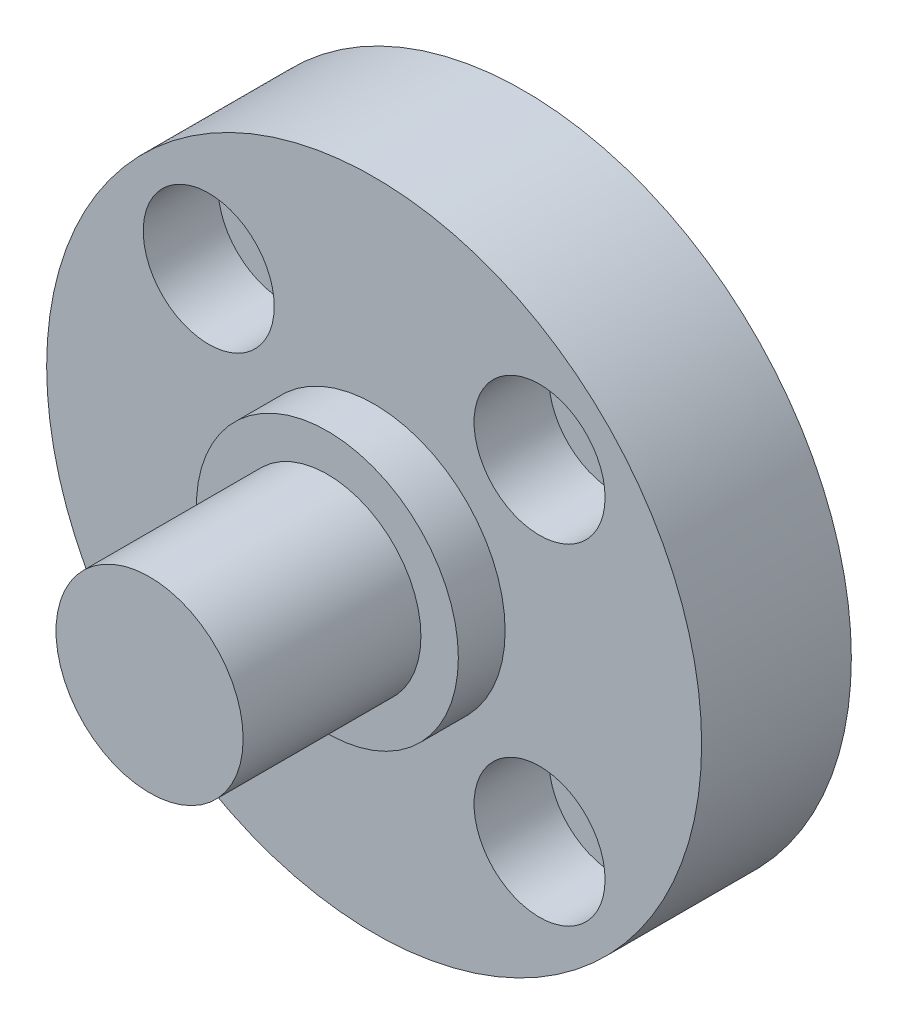
ISO-10303-21;
HEADER;
FILE_DESCRIPTION(('STEP AP214'),'2;1');
FILE_NAME('part.step','',(''),(''),'','','');
FILE_SCHEMA(('AUTOMOTIVE_DESIGN { 1 0 10303 214 1 1 1 1 }'));
ENDSEC;
DATA;
#1=APPLICATION_CONTEXT('core data for automotive mechanical design processes');
#2=APPLICATION_PROTOCOL_DEFINITION('international standard','automotive_design',2000,#1);
#3=PRODUCT_CONTEXT('',#1,'mechanical');
#4=PRODUCT('Part','Part','',(#3));
#5=PRODUCT_RELATED_PRODUCT_CATEGORY('part','',(#4));
#6=PRODUCT_DEFINITION_FORMATION('','',#4);
#7=PRODUCT_DEFINITION_CONTEXT('part definition',#1,'design');
#8=PRODUCT_DEFINITION('design','',#6,#7);
#9=PRODUCT_DEFINITION_SHAPE('','',#8);
#10=(LENGTH_UNIT() NAMED_UNIT(*) SI_UNIT(.MILLI.,.METRE.));
#11=(NAMED_UNIT(*) PLANE_ANGLE_UNIT() SI_UNIT($,.RADIAN.));
#12=(NAMED_UNIT(*) SI_UNIT($,.STERADIAN.) SOLID_ANGLE_UNIT());
#13=UNCERTAINTY_MEASURE_WITH_UNIT(LENGTH_MEASURE(1.E-05),#10,'distance_accuracy_value','');
#14=(GEOMETRIC_REPRESENTATION_CONTEXT(3) GLOBAL_UNCERTAINTY_ASSIGNED_CONTEXT((#13)) GLOBAL_UNIT_ASSIGNED_CONTEXT((#10,
#11,#12)) REPRESENTATION_CONTEXT('',''));
#15=CARTESIAN_POINT('',(0.,0.,0.));
#16=DIRECTION('',(0.,0.,1.));
#17=DIRECTION('',(1.,0.,0.));
#18=AXIS2_PLACEMENT_3D('',#15,#16,#17);
#19=CARTESIAN_POINT('',(8.83883476483184,8.83883476483185,0.));
#20=DIRECTION('',(0.,0.,1.));
#21=DIRECTION('',(1.,0.,0.));
#22=AXIS2_PLACEMENT_3D('',#19,#20,#21);
#23=CYLINDRICAL_SURFACE('',#22,1.6);
#24=CARTESIAN_POINT('',(8.83883476483184,8.83883476483185,0.));
#25=DIRECTION('',(0.,0.,1.));
#26=DIRECTION('',(1.,0.,0.));
#27=AXIS2_PLACEMENT_3D('',#24,#25,#26);
#28=CIRCLE('',#27,1.6);
#29=CARTESIAN_POINT('',(10.4388347648318,8.83883476483185,0.));
#30=VERTEX_POINT('',#29);
#31=EDGE_CURVE('E286',#30,#30,#28,.T.);
#32=ORIENTED_EDGE('',*,*,#31,.F.);
#33=EDGE_LOOP('',(#32));
#34=FACE_BOUND('',#33,.T.);
#35=CARTESIAN_POINT('',(8.83883476483184,8.83883476483185,4.));
#36=DIRECTION('',(0.,0.,1.));
#37=DIRECTION('',(1.,0.,0.));
#38=AXIS2_PLACEMENT_3D('',#35,#36,#37);
#39=CIRCLE('',#38,1.6);
#40=CARTESIAN_POINT('',(10.4388347648318,8.83883476483185,4.));
#41=VERTEX_POINT('',#40);
#42=EDGE_CURVE('E273',#41,#41,#39,.T.);
#43=ORIENTED_EDGE('',*,*,#42,.T.);
#44=EDGE_LOOP('',(#43));
#45=FACE_BOUND('',#44,.T.);
#46=ADVANCED_FACE('F32',(#34,#45),#23,.F.);
#47=CARTESIAN_POINT('',(8.83883476483184,-8.83883476483184,0.));
#48=DIRECTION('',(0.,0.,1.));
#49=DIRECTION('',(1.,0.,0.));
#50=AXIS2_PLACEMENT_3D('',#47,#48,#49);
#51=CYLINDRICAL_SURFACE('',#50,1.60000000000002);
#52=CARTESIAN_POINT('',(8.83883476483184,-8.83883476483184,0.));
#53=DIRECTION('',(0.,0.,1.));
#54=DIRECTION('',(1.,0.,0.));
#55=AXIS2_PLACEMENT_3D('',#52,#53,#54);
#56=CIRCLE('',#55,1.60000000000002);
#57=CARTESIAN_POINT('',(10.4388347648319,-8.83883476483184,0.));
#58=VERTEX_POINT('',#57);
#59=EDGE_CURVE('E283',#58,#58,#56,.T.);
#60=ORIENTED_EDGE('',*,*,#59,.F.);
#61=EDGE_LOOP('',(#60));
#62=FACE_BOUND('',#61,.T.);
#63=CARTESIAN_POINT('',(8.83883476483184,-8.83883476483184,4.));
#64=DIRECTION('',(0.,0.,1.));
#65=DIRECTION('',(1.,0.,0.));
#66=AXIS2_PLACEMENT_3D('',#63,#64,#65);
#67=CIRCLE('',#66,1.60000000000002);
#68=CARTESIAN_POINT('',(10.4388347648319,-8.83883476483184,4.));
#69=VERTEX_POINT('',#68);
#70=EDGE_CURVE('E306',#69,#69,#67,.T.);
#71=ORIENTED_EDGE('',*,*,#70,.T.);
#72=EDGE_LOOP('',(#71));
#73=FACE_BOUND('',#72,.T.);
#74=ADVANCED_FACE('F77',(#62,#73),#51,.F.);
#75=CARTESIAN_POINT('',(-8.83883476483185,-8.83883476483184,0.));
#76=DIRECTION('',(0.,0.,1.));
#77=DIRECTION('',(1.,0.,0.));
#78=AXIS2_PLACEMENT_3D('',#75,#76,#77);
#79=CYLINDRICAL_SURFACE('',#78,1.60000000000004);
#80=CARTESIAN_POINT('',(-8.83883476483185,-8.83883476483184,0.));
#81=DIRECTION('',(0.,0.,1.));
#82=DIRECTION('',(1.,0.,0.));
#83=AXIS2_PLACEMENT_3D('',#80,#81,#82);
#84=CIRCLE('',#83,1.60000000000004);
#85=CARTESIAN_POINT('',(-7.23883476483181,-8.83883476483184,0.));
#86=VERTEX_POINT('',#85);
#87=EDGE_CURVE('E287',#86,#86,#84,.T.);
#88=ORIENTED_EDGE('',*,*,#87,.F.);
#89=EDGE_LOOP('',(#88));
#90=FACE_BOUND('',#89,.T.);
#91=CARTESIAN_POINT('',(-8.83883476483185,-8.83883476483184,4.));
#92=DIRECTION('',(0.,0.,1.));
#93=DIRECTION('',(1.,0.,0.));
#94=AXIS2_PLACEMENT_3D('',#91,#92,#93);
#95=CIRCLE('',#94,1.60000000000004);
#96=CARTESIAN_POINT('',(-7.23883476483181,-8.83883476483184,4.));
#97=VERTEX_POINT('',#96);
#98=EDGE_CURVE('E271',#97,#97,#95,.T.);
#99=ORIENTED_EDGE('',*,*,#98,.T.);
#100=EDGE_LOOP('',(#99));
#101=FACE_BOUND('',#100,.T.);
#102=ADVANCED_FACE('F83',(#90,#101),#79,.F.);
#103=CARTESIAN_POINT('',(-8.83883476483185,8.83883476483184,0.));
#104=DIRECTION('',(0.,0.,1.));
#105=DIRECTION('',(1.,0.,0.));
#106=AXIS2_PLACEMENT_3D('',#103,#104,#105);
#107=CYLINDRICAL_SURFACE('',#106,1.60000000000006);
#108=CARTESIAN_POINT('',(-8.83883476483185,8.83883476483184,0.));
#109=DIRECTION('',(0.,0.,1.));
#110=DIRECTION('',(1.,0.,0.));
#111=AXIS2_PLACEMENT_3D('',#108,#109,#110);
#112=CIRCLE('',#111,1.60000000000006);
#113=CARTESIAN_POINT('',(-7.23883476483179,8.83883476483184,0.));
#114=VERTEX_POINT('',#113);
#115=EDGE_CURVE('E257',#114,#114,#112,.T.);
#116=ORIENTED_EDGE('',*,*,#115,.F.);
#117=EDGE_LOOP('',(#116));
#118=FACE_BOUND('',#117,.T.);
#119=CARTESIAN_POINT('',(-8.83883476483185,8.83883476483184,4.));
#120=DIRECTION('',(0.,0.,1.));
#121=DIRECTION('',(1.,0.,0.));
#122=AXIS2_PLACEMENT_3D('',#119,#120,#121);
#123=CIRCLE('',#122,1.60000000000006);
#124=CARTESIAN_POINT('',(-7.23883476483179,8.83883476483184,4.));
#125=VERTEX_POINT('',#124);
#126=EDGE_CURVE('E260',#125,#125,#123,.T.);
#127=ORIENTED_EDGE('',*,*,#126,.T.);
#128=EDGE_LOOP('',(#127));
#129=FACE_BOUND('',#128,.T.);
#130=ADVANCED_FACE('F90',(#118,#129),#107,.F.);
#131=CARTESIAN_POINT('',(0.,0.,8.));
#132=DIRECTION('',(0.,0.,-1.));
#133=DIRECTION('',(-1.,0.,0.));
#134=AXIS2_PLACEMENT_3D('',#131,#132,#133);
#135=CYLINDRICAL_SURFACE('',#134,17.5);
#136=CARTESIAN_POINT('',(0.,0.,8.));
#137=DIRECTION('',(0.,0.,1.));
#138=DIRECTION('',(1.,0.,0.));
#139=AXIS2_PLACEMENT_3D('',#136,#137,#138);
#140=CIRCLE('',#139,17.5);
#141=CARTESIAN_POINT('',(17.5,0.,8.));
#142=VERTEX_POINT('',#141);
#143=EDGE_CURVE('E45',#142,#142,#140,.T.);
#144=ORIENTED_EDGE('',*,*,#143,.F.);
#145=EDGE_LOOP('',(#144));
#146=FACE_BOUND('',#145,.T.);
#147=CARTESIAN_POINT('',(0.,0.,0.));
#148=DIRECTION('',(0.,0.,1.));
#149=DIRECTION('',(1.,0.,0.));
#150=AXIS2_PLACEMENT_3D('',#147,#148,#149);
#151=CIRCLE('',#150,17.5);
#152=CARTESIAN_POINT('',(17.5,0.,0.));
#153=VERTEX_POINT('',#152);
#154=EDGE_CURVE('E36',#153,#153,#151,.T.);
#155=ORIENTED_EDGE('',*,*,#154,.T.);
#156=EDGE_LOOP('',(#155));
#157=FACE_BOUND('',#156,.T.);
#158=ADVANCED_FACE('F34',(#146,#157),#135,.T.);
#159=CARTESIAN_POINT('',(0.,0.,8.));
#160=DIRECTION('',(0.,0.,1.));
#161=DIRECTION('',(1.,0.,0.));
#162=AXIS2_PLACEMENT_3D('',#159,#160,#161);
#163=PLANE('',#162);
#164=CARTESIAN_POINT('',(-8.83883476483185,8.83883476483184,8.));
#165=DIRECTION('',(0.,0.,1.));
#166=DIRECTION('',(1.,0.,0.));
#167=AXIS2_PLACEMENT_3D('',#164,#165,#166);
#168=CIRCLE('',#167,3.50000000000006);
#169=CARTESIAN_POINT('',(-5.33883476483179,8.83883476483184,8.));
#170=VERTEX_POINT('',#169);
#171=EDGE_CURVE('E261',#170,#170,#168,.T.);
#172=ORIENTED_EDGE('',*,*,#171,.F.);
#173=EDGE_LOOP('',(#172));
#174=FACE_BOUND('',#173,.T.);
#175=CARTESIAN_POINT('',(-8.83883476483184,-8.83883476483185,8.));
#176=DIRECTION('',(0.,0.,1.));
#177=DIRECTION('',(1.,0.,0.));
#178=AXIS2_PLACEMENT_3D('',#175,#176,#177);
#179=CIRCLE('',#178,3.50000000000004);
#180=CARTESIAN_POINT('',(-5.3388347648318,-8.83883476483185,8.));
#181=VERTEX_POINT('',#180);
#182=EDGE_CURVE('E268',#181,#181,#179,.T.);
#183=ORIENTED_EDGE('',*,*,#182,.F.);
#184=EDGE_LOOP('',(#183));
#185=FACE_BOUND('',#184,.T.);
#186=CARTESIAN_POINT('',(8.83883476483184,-8.83883476483184,8.));
#187=DIRECTION('',(0.,0.,1.));
#188=DIRECTION('',(1.,0.,0.));
#189=AXIS2_PLACEMENT_3D('',#186,#187,#188);
#190=CIRCLE('',#189,3.50000000000002);
#191=CARTESIAN_POINT('',(12.3388347648319,-8.83883476483184,8.));
#192=VERTEX_POINT('',#191);
#193=EDGE_CURVE('E303',#192,#192,#190,.T.);
#194=ORIENTED_EDGE('',*,*,#193,.F.);
#195=EDGE_LOOP('',(#194));
#196=FACE_BOUND('',#195,.T.);
#197=CARTESIAN_POINT('',(8.83883476483184,8.83883476483185,8.));
#198=DIRECTION('',(0.,0.,1.));
#199=DIRECTION('',(1.,0.,0.));
#200=AXIS2_PLACEMENT_3D('',#197,#198,#199);
#201=CIRCLE('',#200,3.5);
#202=CARTESIAN_POINT('',(12.3388347648318,8.83883476483185,8.));
#203=VERTEX_POINT('',#202);
#204=EDGE_CURVE('E276',#203,#203,#201,.T.);
#205=ORIENTED_EDGE('',*,*,#204,.F.);
#206=EDGE_LOOP('',(#205));
#207=FACE_BOUND('',#206,.T.);
#208=CARTESIAN_POINT('',(0.,0.,8.));
#209=DIRECTION('',(0.,0.,1.));
#210=DIRECTION('',(1.,0.,0.));
#211=AXIS2_PLACEMENT_3D('',#208,#209,#210);
#212=CIRCLE('',#211,7.);
#213=CARTESIAN_POINT('',(7.,0.,8.));
#214=VERTEX_POINT('',#213);
#215=EDGE_CURVE('E40',#214,#214,#212,.T.);
#216=ORIENTED_EDGE('',*,*,#215,.F.);
#217=EDGE_LOOP('',(#216));
#218=FACE_BOUND('',#217,.T.);
#219=ORIENTED_EDGE('',*,*,#143,.T.);
#220=EDGE_LOOP('',(#219));
#221=FACE_BOUND('',#220,.T.);
#222=ADVANCED_FACE('F63',(#174,#185,#196,#207,#218,#221),#163,.T.);
#223=CARTESIAN_POINT('',(0.,0.,0.));
#224=DIRECTION('',(0.,0.,1.));
#225=DIRECTION('',(1.,0.,0.));
#226=AXIS2_PLACEMENT_3D('',#223,#224,#225);
#227=PLANE('',#226);
#228=ORIENTED_EDGE('',*,*,#115,.T.);
#229=EDGE_LOOP('',(#228));
#230=FACE_BOUND('',#229,.T.);
#231=ORIENTED_EDGE('',*,*,#87,.T.);
#232=EDGE_LOOP('',(#231));
#233=FACE_BOUND('',#232,.T.);
#234=ORIENTED_EDGE('',*,*,#59,.T.);
#235=EDGE_LOOP('',(#234));
#236=FACE_BOUND('',#235,.T.);
#237=ORIENTED_EDGE('',*,*,#31,.T.);
#238=EDGE_LOOP('',(#237));
#239=FACE_BOUND('',#238,.T.);
#240=ORIENTED_EDGE('',*,*,#154,.F.);
#241=EDGE_LOOP('',(#240));
#242=FACE_BOUND('',#241,.T.);
#243=ADVANCED_FACE('F60',(#230,#233,#236,#239,#242),#227,.F.);
#244=CARTESIAN_POINT('',(0.,0.,10.5));
#245=DIRECTION('',(0.,0.,-1.));
#246=DIRECTION('',(-1.,0.,0.));
#247=AXIS2_PLACEMENT_3D('',#244,#245,#246);
#248=CYLINDRICAL_SURFACE('',#247,7.);
#249=CARTESIAN_POINT('',(0.,0.,10.5));
#250=DIRECTION('',(0.,0.,1.));
#251=DIRECTION('',(1.,0.,0.));
#252=AXIS2_PLACEMENT_3D('',#249,#250,#251);
#253=CIRCLE('',#252,7.);
#254=CARTESIAN_POINT('',(7.,0.,10.5));
#255=VERTEX_POINT('',#254);
#256=EDGE_CURVE('E51',#255,#255,#253,.T.);
#257=ORIENTED_EDGE('',*,*,#256,.F.);
#258=EDGE_LOOP('',(#257));
#259=FACE_BOUND('',#258,.T.);
#260=ORIENTED_EDGE('',*,*,#215,.T.);
#261=EDGE_LOOP('',(#260));
#262=FACE_BOUND('',#261,.T.);
#263=ADVANCED_FACE('F62',(#259,#262),#248,.T.);
#264=CARTESIAN_POINT('',(0.,0.,10.5));
#265=DIRECTION('',(0.,0.,1.));
#266=DIRECTION('',(1.,0.,0.));
#267=AXIS2_PLACEMENT_3D('',#264,#265,#266);
#268=PLANE('',#267);
#269=CARTESIAN_POINT('',(0.,0.,10.5));
#270=DIRECTION('',(0.,0.,1.));
#271=DIRECTION('',(1.,0.,0.));
#272=AXIS2_PLACEMENT_3D('',#269,#270,#271);
#273=CIRCLE('',#272,5.);
#274=CARTESIAN_POINT('',(5.,0.,10.5));
#275=VERTEX_POINT('',#274);
#276=EDGE_CURVE('E10',#275,#275,#273,.T.);
#277=ORIENTED_EDGE('',*,*,#276,.F.);
#278=EDGE_LOOP('',(#277));
#279=FACE_BOUND('',#278,.T.);
#280=ORIENTED_EDGE('',*,*,#256,.T.);
#281=EDGE_LOOP('',(#280));
#282=FACE_BOUND('',#281,.T.);
#283=ADVANCED_FACE('F69',(#279,#282),#268,.T.);
#284=CARTESIAN_POINT('',(0.,0.,20.));
#285=DIRECTION('',(0.,0.,-1.));
#286=DIRECTION('',(-1.,0.,0.));
#287=AXIS2_PLACEMENT_3D('',#284,#285,#286);
#288=CYLINDRICAL_SURFACE('',#287,5.);
#289=CARTESIAN_POINT('',(0.,0.,20.));
#290=DIRECTION('',(0.,0.,1.));
#291=DIRECTION('',(1.,0.,0.));
#292=AXIS2_PLACEMENT_3D('',#289,#290,#291);
#293=CIRCLE('',#292,5.);
#294=CARTESIAN_POINT('',(5.,0.,20.));
#295=VERTEX_POINT('',#294);
#296=EDGE_CURVE('E49',#295,#295,#293,.T.);
#297=ORIENTED_EDGE('',*,*,#296,.F.);
#298=EDGE_LOOP('',(#297));
#299=FACE_BOUND('',#298,.T.);
#300=ORIENTED_EDGE('',*,*,#276,.T.);
#301=EDGE_LOOP('',(#300));
#302=FACE_BOUND('',#301,.T.);
#303=ADVANCED_FACE('F96',(#299,#302),#288,.T.);
#304=CARTESIAN_POINT('',(0.,0.,20.));
#305=DIRECTION('',(0.,0.,1.));
#306=DIRECTION('',(1.,0.,0.));
#307=AXIS2_PLACEMENT_3D('',#304,#305,#306);
#308=PLANE('',#307);
#309=ORIENTED_EDGE('',*,*,#296,.T.);
#310=EDGE_LOOP('',(#309));
#311=FACE_BOUND('',#310,.T.);
#312=ADVANCED_FACE('F92',(#311),#308,.T.);
#313=CARTESIAN_POINT('',(-8.83883476483185,8.83883476483184,4.));
#314=DIRECTION('',(0.,0.,1.));
#315=DIRECTION('',(1.,0.,0.));
#316=AXIS2_PLACEMENT_3D('',#313,#314,#315);
#317=CYLINDRICAL_SURFACE('',#316,3.50000000000006);
#318=CARTESIAN_POINT('',(-8.83883476483185,8.83883476483184,4.));
#319=DIRECTION('',(0.,0.,1.));
#320=DIRECTION('',(1.,0.,0.));
#321=AXIS2_PLACEMENT_3D('',#318,#319,#320);
#322=CIRCLE('',#321,3.50000000000006);
#323=CARTESIAN_POINT('',(-5.33883476483179,8.83883476483184,4.));
#324=VERTEX_POINT('',#323);
#325=EDGE_CURVE('E264',#324,#324,#322,.T.);
#326=ORIENTED_EDGE('',*,*,#325,.F.);
#327=EDGE_LOOP('',(#326));
#328=FACE_BOUND('',#327,.T.);
#329=ORIENTED_EDGE('',*,*,#171,.T.);
#330=EDGE_LOOP('',(#329));
#331=FACE_BOUND('',#330,.T.);
#332=ADVANCED_FACE('F95',(#328,#331),#317,.F.);
#333=CARTESIAN_POINT('',(-8.83883476483185,8.83883476483184,4.));
#334=DIRECTION('',(0.,0.,1.));
#335=DIRECTION('',(1.,0.,0.));
#336=AXIS2_PLACEMENT_3D('',#333,#334,#335);
#337=PLANE('',#336);
#338=ORIENTED_EDGE('',*,*,#126,.F.);
#339=EDGE_LOOP('',(#338));
#340=FACE_BOUND('',#339,.T.);
#341=ORIENTED_EDGE('',*,*,#325,.T.);
#342=EDGE_LOOP('',(#341));
#343=FACE_BOUND('',#342,.T.);
#344=ADVANCED_FACE('F126',(#340,#343),#337,.T.);
#345=CARTESIAN_POINT('',(-8.83883476483184,-8.83883476483185,4.));
#346=DIRECTION('',(0.,0.,1.));
#347=DIRECTION('',(1.,0.,0.));
#348=AXIS2_PLACEMENT_3D('',#345,#346,#347);
#349=CYLINDRICAL_SURFACE('',#348,3.50000000000004);
#350=CARTESIAN_POINT('',(-8.83883476483184,-8.83883476483185,4.));
#351=DIRECTION('',(0.,0.,1.));
#352=DIRECTION('',(1.,0.,0.));
#353=AXIS2_PLACEMENT_3D('',#350,#351,#352);
#354=CIRCLE('',#353,3.50000000000004);
#355=CARTESIAN_POINT('',(-5.3388347648318,-8.83883476483185,4.));
#356=VERTEX_POINT('',#355);
#357=EDGE_CURVE('E301',#356,#356,#354,.T.);
#358=ORIENTED_EDGE('',*,*,#357,.F.);
#359=EDGE_LOOP('',(#358));
#360=FACE_BOUND('',#359,.T.);
#361=ORIENTED_EDGE('',*,*,#182,.T.);
#362=EDGE_LOOP('',(#361));
#363=FACE_BOUND('',#362,.T.);
#364=ADVANCED_FACE('F135',(#360,#363),#349,.F.);
#365=CARTESIAN_POINT('',(-8.83883476483184,-8.83883476483185,4.));
#366=DIRECTION('',(0.,0.,1.));
#367=DIRECTION('',(1.,0.,0.));
#368=AXIS2_PLACEMENT_3D('',#365,#366,#367);
#369=PLANE('',#368);
#370=ORIENTED_EDGE('',*,*,#98,.F.);
#371=EDGE_LOOP('',(#370));
#372=FACE_BOUND('',#371,.T.);
#373=ORIENTED_EDGE('',*,*,#357,.T.);
#374=EDGE_LOOP('',(#373));
#375=FACE_BOUND('',#374,.T.);
#376=ADVANCED_FACE('F143',(#372,#375),#369,.T.);
#377=CARTESIAN_POINT('',(8.83883476483184,-8.83883476483184,4.));
#378=DIRECTION('',(0.,0.,1.));
#379=DIRECTION('',(1.,0.,0.));
#380=AXIS2_PLACEMENT_3D('',#377,#378,#379);
#381=CYLINDRICAL_SURFACE('',#380,3.50000000000002);
#382=CARTESIAN_POINT('',(8.83883476483184,-8.83883476483184,4.));
#383=DIRECTION('',(0.,0.,1.));
#384=DIRECTION('',(1.,0.,0.));
#385=AXIS2_PLACEMENT_3D('',#382,#383,#384);
#386=CIRCLE('',#385,3.50000000000002);
#387=CARTESIAN_POINT('',(12.3388347648319,-8.83883476483184,4.));
#388=VERTEX_POINT('',#387);
#389=EDGE_CURVE('E277',#388,#388,#386,.T.);
#390=ORIENTED_EDGE('',*,*,#389,.F.);
#391=EDGE_LOOP('',(#390));
#392=FACE_BOUND('',#391,.T.);
#393=ORIENTED_EDGE('',*,*,#193,.T.);
#394=EDGE_LOOP('',(#393));
#395=FACE_BOUND('',#394,.T.);
#396=ADVANCED_FACE('F151',(#392,#395),#381,.F.);
#397=CARTESIAN_POINT('',(8.83883476483184,-8.83883476483184,4.));
#398=DIRECTION('',(0.,0.,1.));
#399=DIRECTION('',(1.,0.,0.));
#400=AXIS2_PLACEMENT_3D('',#397,#398,#399);
#401=PLANE('',#400);
#402=ORIENTED_EDGE('',*,*,#70,.F.);
#403=EDGE_LOOP('',(#402));
#404=FACE_BOUND('',#403,.T.);
#405=ORIENTED_EDGE('',*,*,#389,.T.);
#406=EDGE_LOOP('',(#405));
#407=FACE_BOUND('',#406,.T.);
#408=ADVANCED_FACE('F159',(#404,#407),#401,.T.);
#409=CARTESIAN_POINT('',(8.83883476483184,8.83883476483185,4.));
#410=DIRECTION('',(0.,0.,1.));
#411=DIRECTION('',(1.,0.,0.));
#412=AXIS2_PLACEMENT_3D('',#409,#410,#411);
#413=CYLINDRICAL_SURFACE('',#412,3.5);
#414=CARTESIAN_POINT('',(8.83883476483184,8.83883476483185,4.));
#415=DIRECTION('',(0.,0.,1.));
#416=DIRECTION('',(1.,0.,0.));
#417=AXIS2_PLACEMENT_3D('',#414,#415,#416);
#418=CIRCLE('',#417,3.5);
#419=CARTESIAN_POINT('',(12.3388347648318,8.83883476483185,4.));
#420=VERTEX_POINT('',#419);
#421=EDGE_CURVE('E278',#420,#420,#418,.T.);
#422=ORIENTED_EDGE('',*,*,#421,.F.);
#423=EDGE_LOOP('',(#422));
#424=FACE_BOUND('',#423,.T.);
#425=ORIENTED_EDGE('',*,*,#204,.T.);
#426=EDGE_LOOP('',(#425));
#427=FACE_BOUND('',#426,.T.);
#428=ADVANCED_FACE('F167',(#424,#427),#413,.F.);
#429=CARTESIAN_POINT('',(8.83883476483184,8.83883476483185,4.));
#430=DIRECTION('',(0.,0.,1.));
#431=DIRECTION('',(1.,0.,0.));
#432=AXIS2_PLACEMENT_3D('',#429,#430,#431);
#433=PLANE('',#432);
#434=ORIENTED_EDGE('',*,*,#42,.F.);
#435=EDGE_LOOP('',(#434));
#436=FACE_BOUND('',#435,.T.);
#437=ORIENTED_EDGE('',*,*,#421,.T.);
#438=EDGE_LOOP('',(#437));
#439=FACE_BOUND('',#438,.T.);
#440=ADVANCED_FACE('F175',(#436,#439),#433,.T.);
#441=CLOSED_SHELL('',(#46,#74,#102,#130,#158,#222,#243,#263,#283,#303,#312,#332,#344,#364,#376,
#396,#408,#428,#440));
#442=MANIFOLD_SOLID_BREP('B2',#441);
#443=ADVANCED_BREP_SHAPE_REPRESENTATION('',(#18,#442),#14);
#444=SHAPE_DEFINITION_REPRESENTATION(#9,#443);
ENDSEC;
END-ISO-10303-21;
